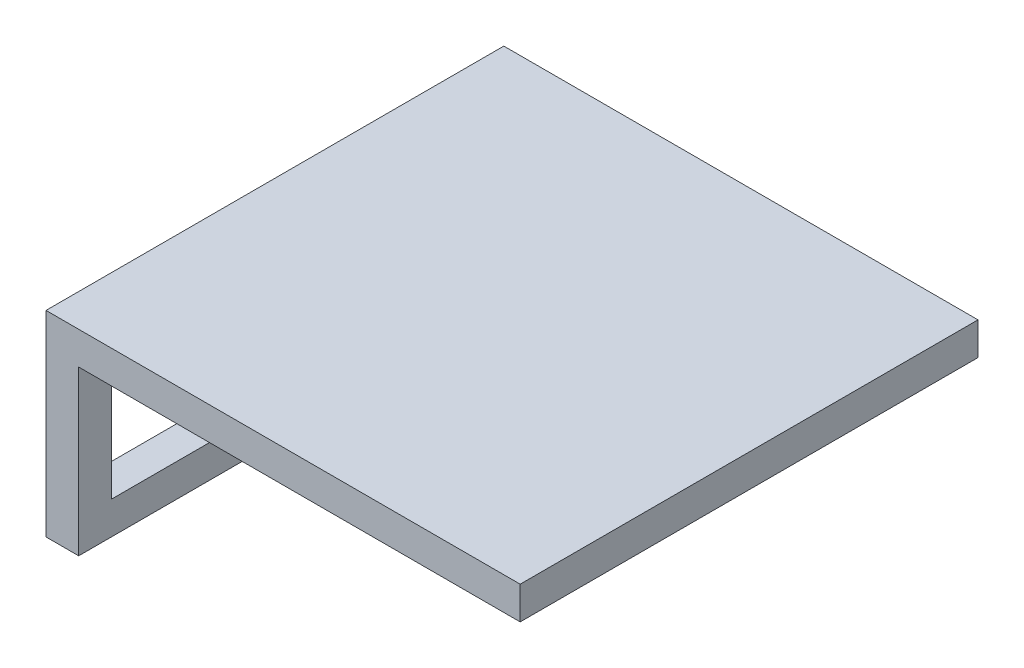
ISO-10303-21;
HEADER;
FILE_DESCRIPTION(('STEP AP214'),'2;1');
FILE_NAME('part.step','',(''),(''),'','','');
FILE_SCHEMA(('AUTOMOTIVE_DESIGN { 1 0 10303 214 1 1 1 1 }'));
ENDSEC;
DATA;
#1=APPLICATION_CONTEXT('core data for automotive mechanical design processes');
#2=APPLICATION_PROTOCOL_DEFINITION('international standard','automotive_design',2000,#1);
#3=PRODUCT_CONTEXT('',#1,'mechanical');
#4=PRODUCT('Part','Part','',(#3));
#5=PRODUCT_RELATED_PRODUCT_CATEGORY('part','',(#4));
#6=PRODUCT_DEFINITION_FORMATION('','',#4);
#7=PRODUCT_DEFINITION_CONTEXT('part definition',#1,'design');
#8=PRODUCT_DEFINITION('design','',#6,#7);
#9=PRODUCT_DEFINITION_SHAPE('','',#8);
#10=(LENGTH_UNIT() NAMED_UNIT(*) SI_UNIT(.MILLI.,.METRE.));
#11=(NAMED_UNIT(*) PLANE_ANGLE_UNIT() SI_UNIT($,.RADIAN.));
#12=(NAMED_UNIT(*) SI_UNIT($,.STERADIAN.) SOLID_ANGLE_UNIT());
#13=UNCERTAINTY_MEASURE_WITH_UNIT(LENGTH_MEASURE(1.E-05),#10,'distance_accuracy_value','');
#14=(GEOMETRIC_REPRESENTATION_CONTEXT(3) GLOBAL_UNCERTAINTY_ASSIGNED_CONTEXT((#13)) GLOBAL_UNIT_ASSIGNED_CONTEXT((#10,
#11,#12)) REPRESENTATION_CONTEXT('',''));
#15=CARTESIAN_POINT('',(0.,0.,0.));
#16=DIRECTION('',(0.,0.,1.));
#17=DIRECTION('',(1.,0.,0.));
#18=AXIS2_PLACEMENT_3D('',#15,#16,#17);
#19=CARTESIAN_POINT('',(-5.,0.,35.));
#20=DIRECTION('',(-1.,0.,0.));
#21=DIRECTION('',(0.,0.,1.));
#22=AXIS2_PLACEMENT_3D('',#19,#20,#21);
#23=PLANE('',#22);
#24=DIRECTION('',(0.,-1.,0.));
#25=VECTOR('',#24,1.);
#26=CARTESIAN_POINT('',(-5.,25.,-30.));
#27=LINE('',#26,#25);
#28=CARTESIAN_POINT('',(-5.,25.,-30.));
#29=VERTEX_POINT('',#28);
#30=CARTESIAN_POINT('',(-5.,5.,-30.));
#31=VERTEX_POINT('',#30);
#32=EDGE_CURVE('E55',#29,#31,#27,.T.);
#33=ORIENTED_EDGE('',*,*,#32,.F.);
#34=DIRECTION('',(0.,0.,-1.));
#35=VECTOR('',#34,1.);
#36=CARTESIAN_POINT('',(-5.,25.,-30.));
#37=LINE('',#36,#35);
#38=CARTESIAN_POINT('',(-5.,25.,30.));
#39=VERTEX_POINT('',#38);
#40=EDGE_CURVE('E133',#39,#29,#37,.T.);
#41=ORIENTED_EDGE('',*,*,#40,.F.);
#42=DIRECTION('',(0.,1.,0.));
#43=VECTOR('',#42,1.);
#44=CARTESIAN_POINT('',(-5.,25.,30.));
#45=LINE('',#44,#43);
#46=CARTESIAN_POINT('',(-5.,5.,30.));
#47=VERTEX_POINT('',#46);
#48=EDGE_CURVE('E118',#47,#39,#45,.T.);
#49=ORIENTED_EDGE('',*,*,#48,.F.);
#50=DIRECTION('',(0.,0.,1.));
#51=VECTOR('',#50,1.);
#52=CARTESIAN_POINT('',(-5.,5.,-30.));
#53=LINE('',#52,#51);
#54=EDGE_CURVE('E127',#31,#47,#53,.T.);
#55=ORIENTED_EDGE('',*,*,#54,.F.);
#56=EDGE_LOOP('',(#33,#41,#49,#55));
#57=FACE_BOUND('',#56,.T.);
#58=DIRECTION('',(0.,1.,0.));
#59=VECTOR('',#58,1.);
#60=CARTESIAN_POINT('',(-5.,0.,-35.));
#61=LINE('',#60,#59);
#62=CARTESIAN_POINT('',(-5.,0.,-35.));
#63=VERTEX_POINT('',#62);
#64=CARTESIAN_POINT('',(-5.,30.,-35.));
#65=VERTEX_POINT('',#64);
#66=EDGE_CURVE('E155',#63,#65,#61,.T.);
#67=ORIENTED_EDGE('',*,*,#66,.F.);
#68=DIRECTION('',(0.,0.,-1.));
#69=VECTOR('',#68,1.);
#70=CARTESIAN_POINT('',(-5.,0.,35.));
#71=LINE('',#70,#69);
#72=CARTESIAN_POINT('',(-5.,0.,35.));
#73=VERTEX_POINT('',#72);
#74=EDGE_CURVE('E11',#73,#63,#71,.T.);
#75=ORIENTED_EDGE('',*,*,#74,.F.);
#76=DIRECTION('',(0.,1.,0.));
#77=VECTOR('',#76,1.);
#78=CARTESIAN_POINT('',(-5.,0.,35.));
#79=LINE('',#78,#77);
#80=CARTESIAN_POINT('',(-5.,30.,35.));
#81=VERTEX_POINT('',#80);
#82=EDGE_CURVE('E158',#73,#81,#79,.T.);
#83=ORIENTED_EDGE('',*,*,#82,.T.);
#84=DIRECTION('',(0.,0.,-1.));
#85=VECTOR('',#84,1.);
#86=CARTESIAN_POINT('',(-5.,30.,35.));
#87=LINE('',#86,#85);
#88=EDGE_CURVE('E174',#81,#65,#87,.T.);
#89=ORIENTED_EDGE('',*,*,#88,.T.);
#90=EDGE_LOOP('',(#67,#75,#83,#89));
#91=FACE_BOUND('',#90,.T.);
#92=ADVANCED_FACE('F40',(#57,#91),#23,.T.);
#93=CARTESIAN_POINT('',(0.,0.,35.));
#94=DIRECTION('',(0.,-1.,0.));
#95=DIRECTION('',(0.,0.,-1.));
#96=AXIS2_PLACEMENT_3D('',#93,#94,#95);
#97=PLANE('',#96);
#98=CARTESIAN_POINT('',(-2.5,0.,-10.));
#99=DIRECTION('',(0.,-1.,0.));
#100=DIRECTION('',(0.,0.,-1.));
#101=AXIS2_PLACEMENT_3D('',#98,#99,#100);
#102=CIRCLE('',#101,1.);
#103=CARTESIAN_POINT('',(-2.5,0.,-11.));
#104=VERTEX_POINT('',#103);
#105=EDGE_CURVE('E152',#104,#104,#102,.T.);
#106=ORIENTED_EDGE('',*,*,#105,.F.);
#107=EDGE_LOOP('',(#106));
#108=FACE_BOUND('',#107,.T.);
#109=CARTESIAN_POINT('',(-2.5,0.,10.));
#110=DIRECTION('',(0.,-1.,0.));
#111=DIRECTION('',(0.,0.,-1.));
#112=AXIS2_PLACEMENT_3D('',#109,#110,#111);
#113=CIRCLE('',#112,1.);
#114=CARTESIAN_POINT('',(-2.5,0.,9.));
#115=VERTEX_POINT('',#114);
#116=EDGE_CURVE('E151',#115,#115,#113,.T.);
#117=ORIENTED_EDGE('',*,*,#116,.F.);
#118=EDGE_LOOP('',(#117));
#119=FACE_BOUND('',#118,.T.);
#120=DIRECTION('',(-1.,0.,0.));
#121=VECTOR('',#120,1.);
#122=CARTESIAN_POINT('',(0.,0.,-35.));
#123=LINE('',#122,#121);
#124=CARTESIAN_POINT('',(0.,0.,-35.));
#125=VERTEX_POINT('',#124);
#126=EDGE_CURVE('E177',#125,#63,#123,.T.);
#127=ORIENTED_EDGE('',*,*,#126,.F.);
#128=DIRECTION('',(0.,0.,-1.));
#129=VECTOR('',#128,1.);
#130=CARTESIAN_POINT('',(0.,0.,35.));
#131=LINE('',#130,#129);
#132=CARTESIAN_POINT('',(0.,0.,35.));
#133=VERTEX_POINT('',#132);
#134=EDGE_CURVE('E48',#133,#125,#131,.T.);
#135=ORIENTED_EDGE('',*,*,#134,.F.);
#136=DIRECTION('',(-1.,0.,0.));
#137=VECTOR('',#136,1.);
#138=CARTESIAN_POINT('',(0.,0.,35.));
#139=LINE('',#138,#137);
#140=EDGE_CURVE('E161',#133,#73,#139,.T.);
#141=ORIENTED_EDGE('',*,*,#140,.T.);
#142=ORIENTED_EDGE('',*,*,#74,.T.);
#143=EDGE_LOOP('',(#127,#135,#141,#142));
#144=FACE_BOUND('',#143,.T.);
#145=ADVANCED_FACE('F212',(#108,#119,#144),#97,.T.);
#146=CARTESIAN_POINT('',(0.,0.,35.));
#147=DIRECTION('',(-1.,0.,0.));
#148=DIRECTION('',(0.,0.,1.));
#149=AXIS2_PLACEMENT_3D('',#146,#147,#148);
#150=PLANE('',#149);
#151=DIRECTION('',(0.,0.,-1.));
#152=VECTOR('',#151,1.);
#153=CARTESIAN_POINT('',(0.,25.,35.));
#154=LINE('',#153,#152);
#155=CARTESIAN_POINT('',(0.,25.,-30.));
#156=VERTEX_POINT('',#155);
#157=CARTESIAN_POINT('',(0.,25.,-35.));
#158=VERTEX_POINT('',#157);
#159=EDGE_CURVE('E196',#156,#158,#154,.T.);
#160=ORIENTED_EDGE('',*,*,#159,.F.);
#161=DIRECTION('',(0.,-1.,0.));
#162=VECTOR('',#161,1.);
#163=CARTESIAN_POINT('',(0.,0.,-30.));
#164=LINE('',#163,#162);
#165=CARTESIAN_POINT('',(0.,5.,-30.));
#166=VERTEX_POINT('',#165);
#167=EDGE_CURVE('E148',#156,#166,#164,.T.);
#168=ORIENTED_EDGE('',*,*,#167,.T.);
#169=DIRECTION('',(0.,0.,1.));
#170=VECTOR('',#169,1.);
#171=CARTESIAN_POINT('',(0.,5.,35.));
#172=LINE('',#171,#170);
#173=CARTESIAN_POINT('',(0.,5.,30.));
#174=VERTEX_POINT('',#173);
#175=EDGE_CURVE('E145',#166,#174,#172,.T.);
#176=ORIENTED_EDGE('',*,*,#175,.T.);
#177=DIRECTION('',(0.,1.,0.));
#178=VECTOR('',#177,1.);
#179=CARTESIAN_POINT('',(0.,0.,30.));
#180=LINE('',#179,#178);
#181=CARTESIAN_POINT('',(0.,25.,30.));
#182=VERTEX_POINT('',#181);
#183=EDGE_CURVE('E121',#174,#182,#180,.T.);
#184=ORIENTED_EDGE('',*,*,#183,.T.);
#185=CARTESIAN_POINT('',(0.,25.,35.));
#186=VERTEX_POINT('',#185);
#187=EDGE_CURVE('E197',#186,#182,#154,.T.);
#188=ORIENTED_EDGE('',*,*,#187,.F.);
#189=DIRECTION('',(0.,1.,0.));
#190=VECTOR('',#189,1.);
#191=CARTESIAN_POINT('',(0.,0.,35.));
#192=LINE('',#191,#190);
#193=EDGE_CURVE('E165',#133,#186,#192,.T.);
#194=ORIENTED_EDGE('',*,*,#193,.F.);
#195=ORIENTED_EDGE('',*,*,#134,.T.);
#196=DIRECTION('',(0.,1.,0.));
#197=VECTOR('',#196,1.);
#198=CARTESIAN_POINT('',(0.,0.,-35.));
#199=LINE('',#198,#197);
#200=EDGE_CURVE('E180',#125,#158,#199,.T.);
#201=ORIENTED_EDGE('',*,*,#200,.T.);
#202=EDGE_LOOP('',(#160,#168,#176,#184,#188,#194,#195,#201));
#203=FACE_BOUND('',#202,.T.);
#204=ADVANCED_FACE('F204',(#203),#150,.F.);
#205=CARTESIAN_POINT('',(0.,25.,35.));
#206=DIRECTION('',(0.,1.,0.));
#207=DIRECTION('',(0.,0.,1.));
#208=AXIS2_PLACEMENT_3D('',#205,#206,#207);
#209=PLANE('',#208);
#210=ORIENTED_EDGE('',*,*,#187,.T.);
#211=DIRECTION('',(-1.,0.,0.));
#212=VECTOR('',#211,1.);
#213=CARTESIAN_POINT('',(5.,25.,30.));
#214=LINE('',#213,#212);
#215=EDGE_CURVE('E123',#182,#39,#214,.T.);
#216=ORIENTED_EDGE('',*,*,#215,.T.);
#217=ORIENTED_EDGE('',*,*,#40,.T.);
#218=DIRECTION('',(-1.,0.,0.));
#219=VECTOR('',#218,1.);
#220=CARTESIAN_POINT('',(5.,25.,-30.));
#221=LINE('',#220,#219);
#222=EDGE_CURVE('E138',#156,#29,#221,.T.);
#223=ORIENTED_EDGE('',*,*,#222,.F.);
#224=ORIENTED_EDGE('',*,*,#159,.T.);
#225=DIRECTION('',(1.,0.,0.));
#226=VECTOR('',#225,1.);
#227=CARTESIAN_POINT('',(0.,25.,-35.));
#228=LINE('',#227,#226);
#229=CARTESIAN_POINT('',(67.5000000000003,25.,-35.));
#230=VERTEX_POINT('',#229);
#231=EDGE_CURVE('E183',#158,#230,#228,.T.);
#232=ORIENTED_EDGE('',*,*,#231,.T.);
#233=DIRECTION('',(0.,0.,-1.));
#234=VECTOR('',#233,1.);
#235=CARTESIAN_POINT('',(67.5000000000003,25.,35.));
#236=LINE('',#235,#234);
#237=CARTESIAN_POINT('',(67.5000000000003,25.,35.));
#238=VERTEX_POINT('',#237);
#239=EDGE_CURVE('E194',#238,#230,#236,.T.);
#240=ORIENTED_EDGE('',*,*,#239,.F.);
#241=DIRECTION('',(1.,0.,0.));
#242=VECTOR('',#241,1.);
#243=CARTESIAN_POINT('',(0.,25.,35.));
#244=LINE('',#243,#242);
#245=EDGE_CURVE('E167',#186,#238,#244,.T.);
#246=ORIENTED_EDGE('',*,*,#245,.F.);
#247=EDGE_LOOP('',(#210,#216,#217,#223,#224,#232,#240,#246));
#248=FACE_BOUND('',#247,.T.);
#249=ADVANCED_FACE('F226',(#248),#209,.F.);
#250=CARTESIAN_POINT('',(67.5000000000003,0.,35.));
#251=DIRECTION('',(1.,0.,0.));
#252=DIRECTION('',(0.,0.,-1.));
#253=AXIS2_PLACEMENT_3D('',#250,#251,#252);
#254=PLANE('',#253);
#255=DIRECTION('',(0.,-1.,0.));
#256=VECTOR('',#255,1.);
#257=CARTESIAN_POINT('',(67.5000000000003,0.,-35.));
#258=LINE('',#257,#256);
#259=CARTESIAN_POINT('',(67.5000000000003,30.,-35.));
#260=VERTEX_POINT('',#259);
#261=EDGE_CURVE('E186',#260,#230,#258,.T.);
#262=ORIENTED_EDGE('',*,*,#261,.F.);
#263=DIRECTION('',(0.,0.,-1.));
#264=VECTOR('',#263,1.);
#265=CARTESIAN_POINT('',(67.5000000000003,30.,35.));
#266=LINE('',#265,#264);
#267=CARTESIAN_POINT('',(67.5000000000003,30.,35.));
#268=VERTEX_POINT('',#267);
#269=EDGE_CURVE('E192',#268,#260,#266,.T.);
#270=ORIENTED_EDGE('',*,*,#269,.F.);
#271=DIRECTION('',(0.,-1.,0.));
#272=VECTOR('',#271,1.);
#273=CARTESIAN_POINT('',(67.5000000000003,0.,35.));
#274=LINE('',#273,#272);
#275=EDGE_CURVE('E169',#268,#238,#274,.T.);
#276=ORIENTED_EDGE('',*,*,#275,.T.);
#277=ORIENTED_EDGE('',*,*,#239,.T.);
#278=EDGE_LOOP('',(#262,#270,#276,#277));
#279=FACE_BOUND('',#278,.T.);
#280=ADVANCED_FACE('F220',(#279),#254,.T.);
#281=CARTESIAN_POINT('',(0.,30.,35.));
#282=DIRECTION('',(0.,-1.,0.));
#283=DIRECTION('',(0.,0.,-1.));
#284=AXIS2_PLACEMENT_3D('',#281,#282,#283);
#285=PLANE('',#284);
#286=DIRECTION('',(-1.,0.,0.));
#287=VECTOR('',#286,1.);
#288=CARTESIAN_POINT('',(0.,30.,-35.));
#289=LINE('',#288,#287);
#290=EDGE_CURVE('E162',#260,#65,#289,.T.);
#291=ORIENTED_EDGE('',*,*,#290,.T.);
#292=ORIENTED_EDGE('',*,*,#88,.F.);
#293=DIRECTION('',(-1.,0.,0.));
#294=VECTOR('',#293,1.);
#295=CARTESIAN_POINT('',(0.,30.,35.));
#296=LINE('',#295,#294);
#297=EDGE_CURVE('E172',#268,#81,#296,.T.);
#298=ORIENTED_EDGE('',*,*,#297,.F.);
#299=ORIENTED_EDGE('',*,*,#269,.T.);
#300=EDGE_LOOP('',(#291,#292,#298,#299));
#301=FACE_BOUND('',#300,.T.);
#302=ADVANCED_FACE('F231',(#301),#285,.F.);
#303=CARTESIAN_POINT('',(0.,0.,35.));
#304=DIRECTION('',(0.,0.,1.));
#305=DIRECTION('',(1.,0.,0.));
#306=AXIS2_PLACEMENT_3D('',#303,#304,#305);
#307=PLANE('',#306);
#308=ORIENTED_EDGE('',*,*,#82,.F.);
#309=ORIENTED_EDGE('',*,*,#140,.F.);
#310=ORIENTED_EDGE('',*,*,#193,.T.);
#311=ORIENTED_EDGE('',*,*,#245,.T.);
#312=ORIENTED_EDGE('',*,*,#275,.F.);
#313=ORIENTED_EDGE('',*,*,#297,.T.);
#314=EDGE_LOOP('',(#308,#309,#310,#311,#312,#313));
#315=FACE_BOUND('',#314,.T.);
#316=ADVANCED_FACE('F230',(#315),#307,.T.);
#317=CARTESIAN_POINT('',(0.,0.,-35.));
#318=DIRECTION('',(0.,0.,1.));
#319=DIRECTION('',(1.,0.,0.));
#320=AXIS2_PLACEMENT_3D('',#317,#318,#319);
#321=PLANE('',#320);
#322=ORIENTED_EDGE('',*,*,#66,.T.);
#323=ORIENTED_EDGE('',*,*,#290,.F.);
#324=ORIENTED_EDGE('',*,*,#261,.T.);
#325=ORIENTED_EDGE('',*,*,#231,.F.);
#326=ORIENTED_EDGE('',*,*,#200,.F.);
#327=ORIENTED_EDGE('',*,*,#126,.T.);
#328=EDGE_LOOP('',(#322,#323,#324,#325,#326,#327));
#329=FACE_BOUND('',#328,.T.);
#330=ADVANCED_FACE('F211',(#329),#321,.F.);
#331=CARTESIAN_POINT('',(-2.5,10.,10.));
#332=DIRECTION('',(0.,-1.,0.));
#333=DIRECTION('',(0.,0.,-1.));
#334=AXIS2_PLACEMENT_3D('',#331,#332,#333);
#335=CYLINDRICAL_SURFACE('',#334,1.);
#336=CARTESIAN_POINT('',(-2.5,5.,10.));
#337=DIRECTION('',(0.,-1.,0.));
#338=DIRECTION('',(0.,0.,-1.));
#339=AXIS2_PLACEMENT_3D('',#336,#337,#338);
#340=CIRCLE('',#339,1.);
#341=CARTESIAN_POINT('',(-2.5,5.,9.));
#342=VERTEX_POINT('',#341);
#343=EDGE_CURVE('E142',#342,#342,#340,.F.);
#344=ORIENTED_EDGE('',*,*,#343,.T.);
#345=EDGE_LOOP('',(#344));
#346=FACE_BOUND('',#345,.T.);
#347=ORIENTED_EDGE('',*,*,#116,.T.);
#348=EDGE_LOOP('',(#347));
#349=FACE_BOUND('',#348,.T.);
#350=ADVANCED_FACE('F286',(#346,#349),#335,.F.);
#351=CARTESIAN_POINT('',(-2.5,10.,-10.));
#352=DIRECTION('',(0.,-1.,0.));
#353=DIRECTION('',(0.,0.,-1.));
#354=AXIS2_PLACEMENT_3D('',#351,#352,#353);
#355=CYLINDRICAL_SURFACE('',#354,1.);
#356=CARTESIAN_POINT('',(-2.5,5.,-10.));
#357=DIRECTION('',(0.,-1.,0.));
#358=DIRECTION('',(0.,0.,-1.));
#359=AXIS2_PLACEMENT_3D('',#356,#357,#358);
#360=CIRCLE('',#359,1.);
#361=CARTESIAN_POINT('',(-2.5,5.,-11.));
#362=VERTEX_POINT('',#361);
#363=EDGE_CURVE('E43',#362,#362,#360,.F.);
#364=ORIENTED_EDGE('',*,*,#363,.T.);
#365=EDGE_LOOP('',(#364));
#366=FACE_BOUND('',#365,.T.);
#367=ORIENTED_EDGE('',*,*,#105,.T.);
#368=EDGE_LOOP('',(#367));
#369=FACE_BOUND('',#368,.T.);
#370=ADVANCED_FACE('F318',(#366,#369),#355,.F.);
#371=CARTESIAN_POINT('',(5.,25.,-30.));
#372=DIRECTION('',(0.,0.,-1.));
#373=DIRECTION('',(0.,1.,0.));
#374=AXIS2_PLACEMENT_3D('',#371,#372,#373);
#375=PLANE('',#374);
#376=ORIENTED_EDGE('',*,*,#222,.T.);
#377=ORIENTED_EDGE('',*,*,#32,.T.);
#378=DIRECTION('',(-1.,0.,0.));
#379=VECTOR('',#378,1.);
#380=CARTESIAN_POINT('',(5.,5.,-30.));
#381=LINE('',#380,#379);
#382=EDGE_CURVE('E124',#166,#31,#381,.T.);
#383=ORIENTED_EDGE('',*,*,#382,.F.);
#384=ORIENTED_EDGE('',*,*,#167,.F.);
#385=EDGE_LOOP('',(#376,#377,#383,#384));
#386=FACE_BOUND('',#385,.T.);
#387=ADVANCED_FACE('F228',(#386),#375,.F.);
#388=CARTESIAN_POINT('',(5.,25.,30.));
#389=DIRECTION('',(0.,0.,1.));
#390=DIRECTION('',(1.,0.,0.));
#391=AXIS2_PLACEMENT_3D('',#388,#389,#390);
#392=PLANE('',#391);
#393=DIRECTION('',(-1.,0.,0.));
#394=VECTOR('',#393,1.);
#395=CARTESIAN_POINT('',(5.,5.,30.));
#396=LINE('',#395,#394);
#397=EDGE_CURVE('E63',#174,#47,#396,.T.);
#398=ORIENTED_EDGE('',*,*,#397,.T.);
#399=ORIENTED_EDGE('',*,*,#48,.T.);
#400=ORIENTED_EDGE('',*,*,#215,.F.);
#401=ORIENTED_EDGE('',*,*,#183,.F.);
#402=EDGE_LOOP('',(#398,#399,#400,#401));
#403=FACE_BOUND('',#402,.T.);
#404=ADVANCED_FACE('F116',(#403),#392,.F.);
#405=CARTESIAN_POINT('',(5.,5.,-30.));
#406=DIRECTION('',(0.,-1.,0.));
#407=DIRECTION('',(0.,0.,-1.));
#408=AXIS2_PLACEMENT_3D('',#405,#406,#407);
#409=PLANE('',#408);
#410=ORIENTED_EDGE('',*,*,#363,.F.);
#411=EDGE_LOOP('',(#410));
#412=FACE_BOUND('',#411,.T.);
#413=ORIENTED_EDGE('',*,*,#343,.F.);
#414=EDGE_LOOP('',(#413));
#415=FACE_BOUND('',#414,.T.);
#416=ORIENTED_EDGE('',*,*,#382,.T.);
#417=ORIENTED_EDGE('',*,*,#54,.T.);
#418=ORIENTED_EDGE('',*,*,#397,.F.);
#419=ORIENTED_EDGE('',*,*,#175,.F.);
#420=EDGE_LOOP('',(#416,#417,#418,#419));
#421=FACE_BOUND('',#420,.T.);
#422=ADVANCED_FACE('F128',(#412,#415,#421),#409,.F.);
#423=CLOSED_SHELL('',(#92,#145,#204,#249,#280,#302,#316,#330,#350,#370,#387,#404,#422));
#424=MANIFOLD_SOLID_BREP('B2',#423);
#425=ADVANCED_BREP_SHAPE_REPRESENTATION('',(#18,#424),#14);
#426=SHAPE_DEFINITION_REPRESENTATION(#9,#425);
ENDSEC;
END-ISO-10303-21;
